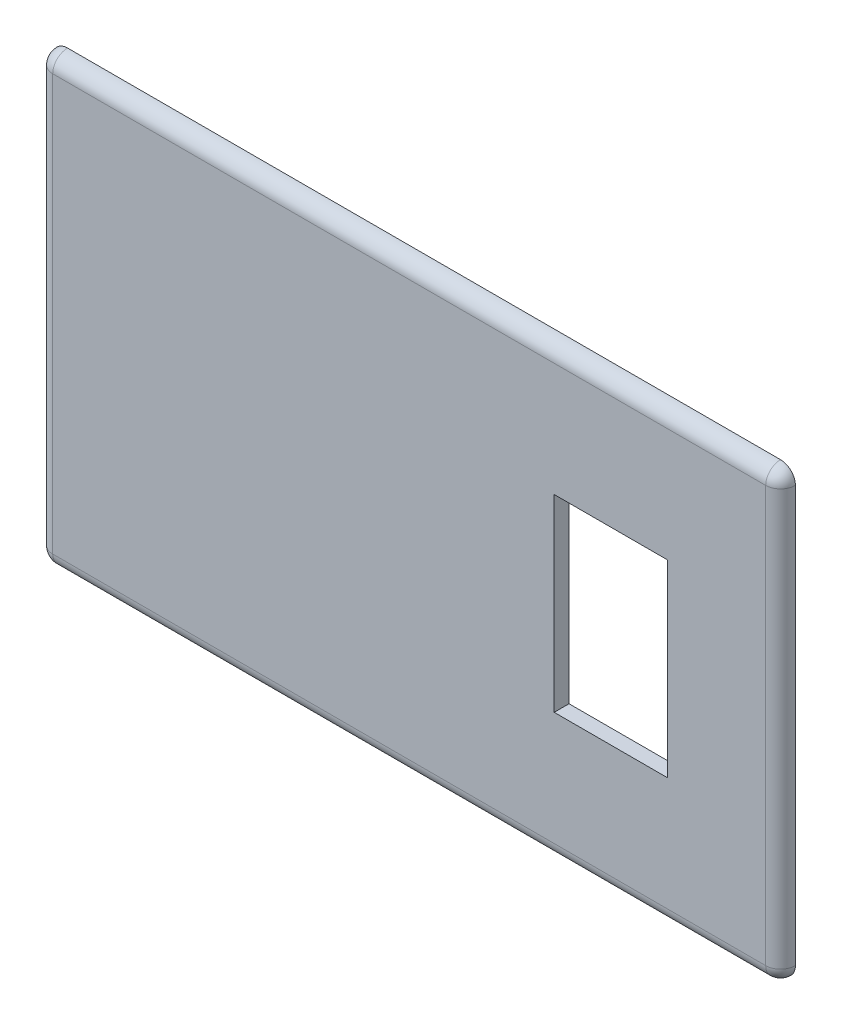
ISO-10303-21;
HEADER;
FILE_DESCRIPTION(('STEP AP214'),'2;1');
FILE_NAME('part.step','',(''),(''),'','','');
FILE_SCHEMA(('AUTOMOTIVE_DESIGN { 1 0 10303 214 1 1 1 1 }'));
ENDSEC;
DATA;
#1=APPLICATION_CONTEXT('core data for automotive mechanical design processes');
#2=APPLICATION_PROTOCOL_DEFINITION('international standard','automotive_design',2000,#1);
#3=PRODUCT_CONTEXT('',#1,'mechanical');
#4=PRODUCT('Part','Part','',(#3));
#5=PRODUCT_RELATED_PRODUCT_CATEGORY('part','',(#4));
#6=PRODUCT_DEFINITION_FORMATION('','',#4);
#7=PRODUCT_DEFINITION_CONTEXT('part definition',#1,'design');
#8=PRODUCT_DEFINITION('design','',#6,#7);
#9=PRODUCT_DEFINITION_SHAPE('','',#8);
#10=(LENGTH_UNIT() NAMED_UNIT(*) SI_UNIT(.MILLI.,.METRE.));
#11=(NAMED_UNIT(*) PLANE_ANGLE_UNIT() SI_UNIT($,.RADIAN.));
#12=(NAMED_UNIT(*) SI_UNIT($,.STERADIAN.) SOLID_ANGLE_UNIT());
#13=UNCERTAINTY_MEASURE_WITH_UNIT(LENGTH_MEASURE(1.E-05),#10,'distance_accuracy_value','');
#14=(GEOMETRIC_REPRESENTATION_CONTEXT(3) GLOBAL_UNCERTAINTY_ASSIGNED_CONTEXT((#13)) GLOBAL_UNIT_ASSIGNED_CONTEXT((#10,
#11,#12)) REPRESENTATION_CONTEXT('',''));
#15=CARTESIAN_POINT('',(0.,0.,0.));
#16=DIRECTION('',(0.,0.,1.));
#17=DIRECTION('',(1.,0.,0.));
#18=AXIS2_PLACEMENT_3D('',#15,#16,#17);
#19=CARTESIAN_POINT('',(0.,0.,2.));
#20=DIRECTION('',(0.,0.,1.));
#21=DIRECTION('',(1.,0.,0.));
#22=AXIS2_PLACEMENT_3D('',#19,#20,#21);
#23=PLANE('',#22);
#24=DIRECTION('',(0.,-1.,0.));
#25=VECTOR('',#24,1.);
#26=CARTESIAN_POINT('',(19.52,12.7,2.));
#27=LINE('',#26,#25);
#28=CARTESIAN_POINT('',(19.52,12.7,2.));
#29=VERTEX_POINT('',#28);
#30=CARTESIAN_POINT('',(19.52,-12.7,2.));
#31=VERTEX_POINT('',#30);
#32=EDGE_CURVE('E50',#29,#31,#27,.T.);
#33=ORIENTED_EDGE('',*,*,#32,.F.);
#34=DIRECTION('',(-1.,0.,0.));
#35=VECTOR('',#34,1.);
#36=CARTESIAN_POINT('',(34.76,12.7,2.));
#37=LINE('',#36,#35);
#38=CARTESIAN_POINT('',(34.76,12.7,2.));
#39=VERTEX_POINT('',#38);
#40=EDGE_CURVE('E130',#39,#29,#37,.T.);
#41=ORIENTED_EDGE('',*,*,#40,.F.);
#42=DIRECTION('',(0.,1.,0.));
#43=VECTOR('',#42,1.);
#44=CARTESIAN_POINT('',(34.76,12.7,2.));
#45=LINE('',#44,#43);
#46=CARTESIAN_POINT('',(34.76,-12.7,2.));
#47=VERTEX_POINT('',#46);
#48=EDGE_CURVE('E133',#47,#39,#45,.T.);
#49=ORIENTED_EDGE('',*,*,#48,.F.);
#50=DIRECTION('',(1.,0.,0.));
#51=VECTOR('',#50,1.);
#52=CARTESIAN_POINT('',(34.76,-12.7,2.));
#53=LINE('',#52,#51);
#54=EDGE_CURVE('E139',#31,#47,#53,.T.);
#55=ORIENTED_EDGE('',*,*,#54,.F.);
#56=EDGE_LOOP('',(#33,#41,#49,#55));
#57=FACE_BOUND('',#56,.T.);
#58=DIRECTION('',(1.,0.,0.));
#59=VECTOR('',#58,1.);
#60=CARTESIAN_POINT('',(0.,28.,2.));
#61=LINE('',#60,#59);
#62=CARTESIAN_POINT('',(48.,28.,2.));
#63=VERTEX_POINT('',#62);
#64=CARTESIAN_POINT('',(-48.,28.,2.));
#65=VERTEX_POINT('',#64);
#66=EDGE_CURVE('E168',#63,#65,#61,.F.);
#67=ORIENTED_EDGE('',*,*,#66,.T.);
#68=DIRECTION('',(0.,1.,0.));
#69=VECTOR('',#68,1.);
#70=CARTESIAN_POINT('',(-48.,0.,2.));
#71=LINE('',#70,#69);
#72=CARTESIAN_POINT('',(-48.,-28.,2.));
#73=VERTEX_POINT('',#72);
#74=EDGE_CURVE('E11',#65,#73,#71,.F.);
#75=ORIENTED_EDGE('',*,*,#74,.T.);
#76=DIRECTION('',(1.,0.,0.));
#77=VECTOR('',#76,1.);
#78=CARTESIAN_POINT('',(50.,-28.,2.));
#79=LINE('',#78,#77);
#80=CARTESIAN_POINT('',(48.,-28.,2.));
#81=VERTEX_POINT('',#80);
#82=EDGE_CURVE('E42',#73,#81,#79,.T.);
#83=ORIENTED_EDGE('',*,*,#82,.T.);
#84=DIRECTION('',(0.,1.,0.));
#85=VECTOR('',#84,1.);
#86=CARTESIAN_POINT('',(48.,30.,2.));
#87=LINE('',#86,#85);
#88=EDGE_CURVE('E170',#81,#63,#87,.T.);
#89=ORIENTED_EDGE('',*,*,#88,.T.);
#90=EDGE_LOOP('',(#67,#75,#83,#89));
#91=FACE_BOUND('',#90,.T.);
#92=ADVANCED_FACE('F33',(#57,#91),#23,.T.);
#93=CARTESIAN_POINT('',(0.,0.,0.));
#94=DIRECTION('',(0.,0.,1.));
#95=DIRECTION('',(1.,0.,0.));
#96=AXIS2_PLACEMENT_3D('',#93,#94,#95);
#97=PLANE('',#96);
#98=DIRECTION('',(-1.,0.,0.));
#99=VECTOR('',#98,1.);
#100=CARTESIAN_POINT('',(34.76,12.7,0.));
#101=LINE('',#100,#99);
#102=CARTESIAN_POINT('',(34.76,12.7,0.));
#103=VERTEX_POINT('',#102);
#104=CARTESIAN_POINT('',(19.52,12.7,0.));
#105=VERTEX_POINT('',#104);
#106=EDGE_CURVE('E120',#103,#105,#101,.T.);
#107=ORIENTED_EDGE('',*,*,#106,.T.);
#108=DIRECTION('',(0.,-1.,0.));
#109=VECTOR('',#108,1.);
#110=CARTESIAN_POINT('',(19.52,12.7,0.));
#111=LINE('',#110,#109);
#112=CARTESIAN_POINT('',(19.52,-12.7,0.));
#113=VERTEX_POINT('',#112);
#114=EDGE_CURVE('E114',#105,#113,#111,.T.);
#115=ORIENTED_EDGE('',*,*,#114,.T.);
#116=DIRECTION('',(1.,0.,0.));
#117=VECTOR('',#116,1.);
#118=CARTESIAN_POINT('',(34.76,-12.7,0.));
#119=LINE('',#118,#117);
#120=CARTESIAN_POINT('',(34.76,-12.7,0.));
#121=VERTEX_POINT('',#120);
#122=EDGE_CURVE('E123',#113,#121,#119,.T.);
#123=ORIENTED_EDGE('',*,*,#122,.T.);
#124=DIRECTION('',(0.,1.,0.));
#125=VECTOR('',#124,1.);
#126=CARTESIAN_POINT('',(34.76,12.7,0.));
#127=LINE('',#126,#125);
#128=EDGE_CURVE('E58',#121,#103,#127,.T.);
#129=ORIENTED_EDGE('',*,*,#128,.T.);
#130=EDGE_LOOP('',(#107,#115,#123,#129));
#131=FACE_BOUND('',#130,.T.);
#132=DIRECTION('',(1.,0.,0.));
#133=VECTOR('',#132,1.);
#134=CARTESIAN_POINT('',(-50.,30.,0.));
#135=LINE('',#134,#133);
#136=CARTESIAN_POINT('',(-48.,30.,0.));
#137=VERTEX_POINT('',#136);
#138=CARTESIAN_POINT('',(48.,30.,0.));
#139=VERTEX_POINT('',#138);
#140=EDGE_CURVE('E155',#137,#139,#135,.T.);
#141=ORIENTED_EDGE('',*,*,#140,.T.);
#142=CARTESIAN_POINT('',(48.,28.,0.));
#143=DIRECTION('',(0.,0.,1.));
#144=DIRECTION('',(1.,0.,0.));
#145=AXIS2_PLACEMENT_3D('',#142,#143,#144);
#146=CIRCLE('',#145,2.);
#147=CARTESIAN_POINT('',(50.,28.,0.));
#148=VERTEX_POINT('',#147);
#149=EDGE_CURVE('E165',#139,#148,#146,.F.);
#150=ORIENTED_EDGE('',*,*,#149,.T.);
#151=DIRECTION('',(0.,1.,0.));
#152=VECTOR('',#151,1.);
#153=CARTESIAN_POINT('',(50.,-30.,0.));
#154=LINE('',#153,#152);
#155=CARTESIAN_POINT('',(50.,-28.,0.));
#156=VERTEX_POINT('',#155);
#157=EDGE_CURVE('E152',#156,#148,#154,.T.);
#158=ORIENTED_EDGE('',*,*,#157,.F.);
#159=CARTESIAN_POINT('',(48.,-28.,0.));
#160=DIRECTION('',(0.,0.,1.));
#161=DIRECTION('',(1.,0.,0.));
#162=AXIS2_PLACEMENT_3D('',#159,#160,#161);
#163=CIRCLE('',#162,2.);
#164=CARTESIAN_POINT('',(48.,-30.,0.));
#165=VERTEX_POINT('',#164);
#166=EDGE_CURVE('E163',#156,#165,#163,.F.);
#167=ORIENTED_EDGE('',*,*,#166,.T.);
#168=DIRECTION('',(1.,0.,0.));
#169=VECTOR('',#168,1.);
#170=CARTESIAN_POINT('',(-50.,-30.,0.));
#171=LINE('',#170,#169);
#172=CARTESIAN_POINT('',(-48.,-30.,0.));
#173=VERTEX_POINT('',#172);
#174=EDGE_CURVE('E149',#173,#165,#171,.T.);
#175=ORIENTED_EDGE('',*,*,#174,.F.);
#176=CARTESIAN_POINT('',(-48.,-28.,0.));
#177=DIRECTION('',(0.,0.,1.));
#178=DIRECTION('',(1.,0.,0.));
#179=AXIS2_PLACEMENT_3D('',#176,#177,#178);
#180=CIRCLE('',#179,2.);
#181=CARTESIAN_POINT('',(-50.,-28.,0.));
#182=VERTEX_POINT('',#181);
#183=EDGE_CURVE('E161',#173,#182,#180,.F.);
#184=ORIENTED_EDGE('',*,*,#183,.T.);
#185=DIRECTION('',(0.,1.,0.));
#186=VECTOR('',#185,1.);
#187=CARTESIAN_POINT('',(-50.,-30.,0.));
#188=LINE('',#187,#186);
#189=CARTESIAN_POINT('',(-50.,28.,0.));
#190=VERTEX_POINT('',#189);
#191=EDGE_CURVE('E157',#182,#190,#188,.T.);
#192=ORIENTED_EDGE('',*,*,#191,.T.);
#193=CARTESIAN_POINT('',(-48.,28.,0.));
#194=DIRECTION('',(0.,0.,1.));
#195=DIRECTION('',(1.,0.,0.));
#196=AXIS2_PLACEMENT_3D('',#193,#194,#195);
#197=CIRCLE('',#196,2.);
#198=EDGE_CURVE('E159',#190,#137,#197,.F.);
#199=ORIENTED_EDGE('',*,*,#198,.T.);
#200=EDGE_LOOP('',(#141,#150,#158,#167,#175,#184,#192,#199));
#201=FACE_BOUND('',#200,.T.);
#202=ADVANCED_FACE('F127',(#131,#201),#97,.F.);
#203=CARTESIAN_POINT('',(-48.,-28.,0.));
#204=DIRECTION('',(0.,0.,1.));
#205=DIRECTION('',(1.,0.,0.));
#206=AXIS2_PLACEMENT_3D('',#203,#204,#205);
#207=SPHERICAL_SURFACE('',#206,2.);
#208=CARTESIAN_POINT('',(-48.,-28.,0.));
#209=DIRECTION('',(0.,-1.,0.));
#210=DIRECTION('',(0.,0.,-1.));
#211=AXIS2_PLACEMENT_3D('',#208,#209,#210);
#212=CIRCLE('',#211,2.);
#213=EDGE_CURVE('E188',#182,#73,#212,.F.);
#214=ORIENTED_EDGE('',*,*,#213,.F.);
#215=ORIENTED_EDGE('',*,*,#183,.F.);
#216=CARTESIAN_POINT('',(-48.,-28.,0.));
#217=DIRECTION('',(-1.,0.,0.));
#218=DIRECTION('',(0.,0.,1.));
#219=AXIS2_PLACEMENT_3D('',#216,#217,#218);
#220=CIRCLE('',#219,2.);
#221=EDGE_CURVE('E37',#73,#173,#220,.F.);
#222=ORIENTED_EDGE('',*,*,#221,.F.);
#223=EDGE_LOOP('',(#214,#215,#222));
#224=FACE_BOUND('',#223,.T.);
#225=ADVANCED_FACE('F35',(#224),#207,.T.);
#226=CARTESIAN_POINT('',(0.,-28.,0.));
#227=DIRECTION('',(-1.,0.,0.));
#228=DIRECTION('',(0.,0.,1.));
#229=AXIS2_PLACEMENT_3D('',#226,#227,#228);
#230=CYLINDRICAL_SURFACE('',#229,2.);
#231=ORIENTED_EDGE('',*,*,#221,.T.);
#232=ORIENTED_EDGE('',*,*,#174,.T.);
#233=CARTESIAN_POINT('',(48.,-28.,0.));
#234=DIRECTION('',(1.,0.,0.));
#235=DIRECTION('',(0.,0.,-1.));
#236=AXIS2_PLACEMENT_3D('',#233,#234,#235);
#237=CIRCLE('',#236,2.);
#238=EDGE_CURVE('E186',#81,#165,#237,.T.);
#239=ORIENTED_EDGE('',*,*,#238,.F.);
#240=ORIENTED_EDGE('',*,*,#82,.F.);
#241=EDGE_LOOP('',(#231,#232,#239,#240));
#242=FACE_BOUND('',#241,.T.);
#243=ADVANCED_FACE('F197',(#242),#230,.T.);
#244=CARTESIAN_POINT('',(-48.,-30.,0.));
#245=DIRECTION('',(0.,1.,0.));
#246=DIRECTION('',(0.,0.,1.));
#247=AXIS2_PLACEMENT_3D('',#244,#245,#246);
#248=CYLINDRICAL_SURFACE('',#247,2.);
#249=ORIENTED_EDGE('',*,*,#213,.T.);
#250=ORIENTED_EDGE('',*,*,#74,.F.);
#251=CARTESIAN_POINT('',(-48.,28.,0.));
#252=DIRECTION('',(0.,1.,0.));
#253=DIRECTION('',(0.,0.,1.));
#254=AXIS2_PLACEMENT_3D('',#251,#252,#253);
#255=CIRCLE('',#254,2.);
#256=EDGE_CURVE('E183',#190,#65,#255,.T.);
#257=ORIENTED_EDGE('',*,*,#256,.F.);
#258=ORIENTED_EDGE('',*,*,#191,.F.);
#259=EDGE_LOOP('',(#249,#250,#257,#258));
#260=FACE_BOUND('',#259,.T.);
#261=ADVANCED_FACE('F221',(#260),#248,.T.);
#262=CARTESIAN_POINT('',(48.,-28.,0.));
#263=DIRECTION('',(0.,0.,1.));
#264=DIRECTION('',(1.,0.,0.));
#265=AXIS2_PLACEMENT_3D('',#262,#263,#264);
#266=SPHERICAL_SURFACE('',#265,2.);
#267=ORIENTED_EDGE('',*,*,#238,.T.);
#268=ORIENTED_EDGE('',*,*,#166,.F.);
#269=CARTESIAN_POINT('',(48.,-28.,0.));
#270=DIRECTION('',(0.,-1.,0.));
#271=DIRECTION('',(0.,0.,-1.));
#272=AXIS2_PLACEMENT_3D('',#269,#270,#271);
#273=CIRCLE('',#272,2.);
#274=EDGE_CURVE('E180',#81,#156,#273,.F.);
#275=ORIENTED_EDGE('',*,*,#274,.F.);
#276=EDGE_LOOP('',(#267,#268,#275));
#277=FACE_BOUND('',#276,.T.);
#278=ADVANCED_FACE('F205',(#277),#266,.T.);
#279=CARTESIAN_POINT('',(-48.,28.,0.));
#280=DIRECTION('',(0.,0.,1.));
#281=DIRECTION('',(1.,0.,0.));
#282=AXIS2_PLACEMENT_3D('',#279,#280,#281);
#283=SPHERICAL_SURFACE('',#282,2.);
#284=ORIENTED_EDGE('',*,*,#198,.F.);
#285=ORIENTED_EDGE('',*,*,#256,.T.);
#286=CARTESIAN_POINT('',(-48.,28.,0.));
#287=DIRECTION('',(-1.,0.,0.));
#288=DIRECTION('',(0.,0.,1.));
#289=AXIS2_PLACEMENT_3D('',#286,#287,#288);
#290=CIRCLE('',#289,2.);
#291=EDGE_CURVE('E177',#137,#65,#290,.F.);
#292=ORIENTED_EDGE('',*,*,#291,.F.);
#293=EDGE_LOOP('',(#284,#285,#292));
#294=FACE_BOUND('',#293,.T.);
#295=ADVANCED_FACE('F220',(#294),#283,.T.);
#296=CARTESIAN_POINT('',(48.,0.,0.));
#297=DIRECTION('',(0.,-1.,0.));
#298=DIRECTION('',(0.,0.,-1.));
#299=AXIS2_PLACEMENT_3D('',#296,#297,#298);
#300=CYLINDRICAL_SURFACE('',#299,2.);
#301=ORIENTED_EDGE('',*,*,#274,.T.);
#302=ORIENTED_EDGE('',*,*,#157,.T.);
#303=CARTESIAN_POINT('',(48.,28.,0.));
#304=DIRECTION('',(0.,1.,0.));
#305=DIRECTION('',(0.,0.,1.));
#306=AXIS2_PLACEMENT_3D('',#303,#304,#305);
#307=CIRCLE('',#306,2.);
#308=EDGE_CURVE('E175',#63,#148,#307,.T.);
#309=ORIENTED_EDGE('',*,*,#308,.F.);
#310=ORIENTED_EDGE('',*,*,#88,.F.);
#311=EDGE_LOOP('',(#301,#302,#309,#310));
#312=FACE_BOUND('',#311,.T.);
#313=ADVANCED_FACE('F208',(#312),#300,.T.);
#314=CARTESIAN_POINT('',(-50.,28.,0.));
#315=DIRECTION('',(1.,0.,0.));
#316=DIRECTION('',(0.,0.,-1.));
#317=AXIS2_PLACEMENT_3D('',#314,#315,#316);
#318=CYLINDRICAL_SURFACE('',#317,2.);
#319=ORIENTED_EDGE('',*,*,#291,.T.);
#320=ORIENTED_EDGE('',*,*,#66,.F.);
#321=CARTESIAN_POINT('',(48.,28.,0.));
#322=DIRECTION('',(1.,0.,0.));
#323=DIRECTION('',(0.,0.,-1.));
#324=AXIS2_PLACEMENT_3D('',#321,#322,#323);
#325=CIRCLE('',#324,2.);
#326=EDGE_CURVE('E145',#139,#63,#325,.T.);
#327=ORIENTED_EDGE('',*,*,#326,.F.);
#328=ORIENTED_EDGE('',*,*,#140,.F.);
#329=EDGE_LOOP('',(#319,#320,#327,#328));
#330=FACE_BOUND('',#329,.T.);
#331=ADVANCED_FACE('F214',(#330),#318,.T.);
#332=CARTESIAN_POINT('',(48.,28.,0.));
#333=DIRECTION('',(0.,0.,1.));
#334=DIRECTION('',(1.,0.,0.));
#335=AXIS2_PLACEMENT_3D('',#332,#333,#334);
#336=SPHERICAL_SURFACE('',#335,2.);
#337=ORIENTED_EDGE('',*,*,#149,.F.);
#338=ORIENTED_EDGE('',*,*,#326,.T.);
#339=ORIENTED_EDGE('',*,*,#308,.T.);
#340=EDGE_LOOP('',(#337,#338,#339));
#341=FACE_BOUND('',#340,.T.);
#342=ADVANCED_FACE('F240',(#341),#336,.T.);
#343=CARTESIAN_POINT('',(19.52,12.7,0.));
#344=DIRECTION('',(-1.,0.,0.));
#345=DIRECTION('',(0.,0.,1.));
#346=AXIS2_PLACEMENT_3D('',#343,#344,#345);
#347=PLANE('',#346);
#348=ORIENTED_EDGE('',*,*,#32,.T.);
#349=DIRECTION('',(0.,0.,1.));
#350=VECTOR('',#349,1.);
#351=CARTESIAN_POINT('',(19.52,-12.7,0.));
#352=LINE('',#351,#350);
#353=EDGE_CURVE('E110',#113,#31,#352,.T.);
#354=ORIENTED_EDGE('',*,*,#353,.F.);
#355=ORIENTED_EDGE('',*,*,#114,.F.);
#356=DIRECTION('',(0.,0.,1.));
#357=VECTOR('',#356,1.);
#358=CARTESIAN_POINT('',(19.52,12.7,0.));
#359=LINE('',#358,#357);
#360=EDGE_CURVE('E143',#105,#29,#359,.T.);
#361=ORIENTED_EDGE('',*,*,#360,.T.);
#362=EDGE_LOOP('',(#348,#354,#355,#361));
#363=FACE_BOUND('',#362,.T.);
#364=ADVANCED_FACE('F112',(#363),#347,.F.);
#365=CARTESIAN_POINT('',(34.76,12.7,0.));
#366=DIRECTION('',(0.,1.,0.));
#367=DIRECTION('',(-1.,0.,0.));
#368=AXIS2_PLACEMENT_3D('',#365,#366,#367);
#369=PLANE('',#368);
#370=ORIENTED_EDGE('',*,*,#40,.T.);
#371=ORIENTED_EDGE('',*,*,#360,.F.);
#372=ORIENTED_EDGE('',*,*,#106,.F.);
#373=DIRECTION('',(0.,0.,1.));
#374=VECTOR('',#373,1.);
#375=CARTESIAN_POINT('',(34.76,12.7,0.));
#376=LINE('',#375,#374);
#377=EDGE_CURVE('E146',#103,#39,#376,.T.);
#378=ORIENTED_EDGE('',*,*,#377,.T.);
#379=EDGE_LOOP('',(#370,#371,#372,#378));
#380=FACE_BOUND('',#379,.T.);
#381=ADVANCED_FACE('F270',(#380),#369,.F.);
#382=CARTESIAN_POINT('',(34.76,12.7,0.));
#383=DIRECTION('',(1.,0.,0.));
#384=DIRECTION('',(0.,1.,0.));
#385=AXIS2_PLACEMENT_3D('',#382,#383,#384);
#386=PLANE('',#385);
#387=ORIENTED_EDGE('',*,*,#48,.T.);
#388=ORIENTED_EDGE('',*,*,#377,.F.);
#389=ORIENTED_EDGE('',*,*,#128,.F.);
#390=DIRECTION('',(0.,0.,1.));
#391=VECTOR('',#390,1.);
#392=CARTESIAN_POINT('',(34.76,-12.7,0.));
#393=LINE('',#392,#391);
#394=EDGE_CURVE('E119',#121,#47,#393,.T.);
#395=ORIENTED_EDGE('',*,*,#394,.T.);
#396=EDGE_LOOP('',(#387,#388,#389,#395));
#397=FACE_BOUND('',#396,.T.);
#398=ADVANCED_FACE('F276',(#397),#386,.F.);
#399=CARTESIAN_POINT('',(34.76,-12.7,0.));
#400=DIRECTION('',(0.,-1.,0.));
#401=DIRECTION('',(1.,0.,0.));
#402=AXIS2_PLACEMENT_3D('',#399,#400,#401);
#403=PLANE('',#402);
#404=ORIENTED_EDGE('',*,*,#54,.T.);
#405=ORIENTED_EDGE('',*,*,#394,.F.);
#406=ORIENTED_EDGE('',*,*,#122,.F.);
#407=ORIENTED_EDGE('',*,*,#353,.T.);
#408=EDGE_LOOP('',(#404,#405,#406,#407));
#409=FACE_BOUND('',#408,.T.);
#410=ADVANCED_FACE('F124',(#409),#403,.F.);
#411=CLOSED_SHELL('',(#92,#202,#225,#243,#261,#278,#295,#313,#331,#342,#364,#381,#398,#410));
#412=MANIFOLD_SOLID_BREP('B2',#411);
#413=ADVANCED_BREP_SHAPE_REPRESENTATION('',(#18,#412),#14);
#414=SHAPE_DEFINITION_REPRESENTATION(#9,#413);
ENDSEC;
END-ISO-10303-21;
